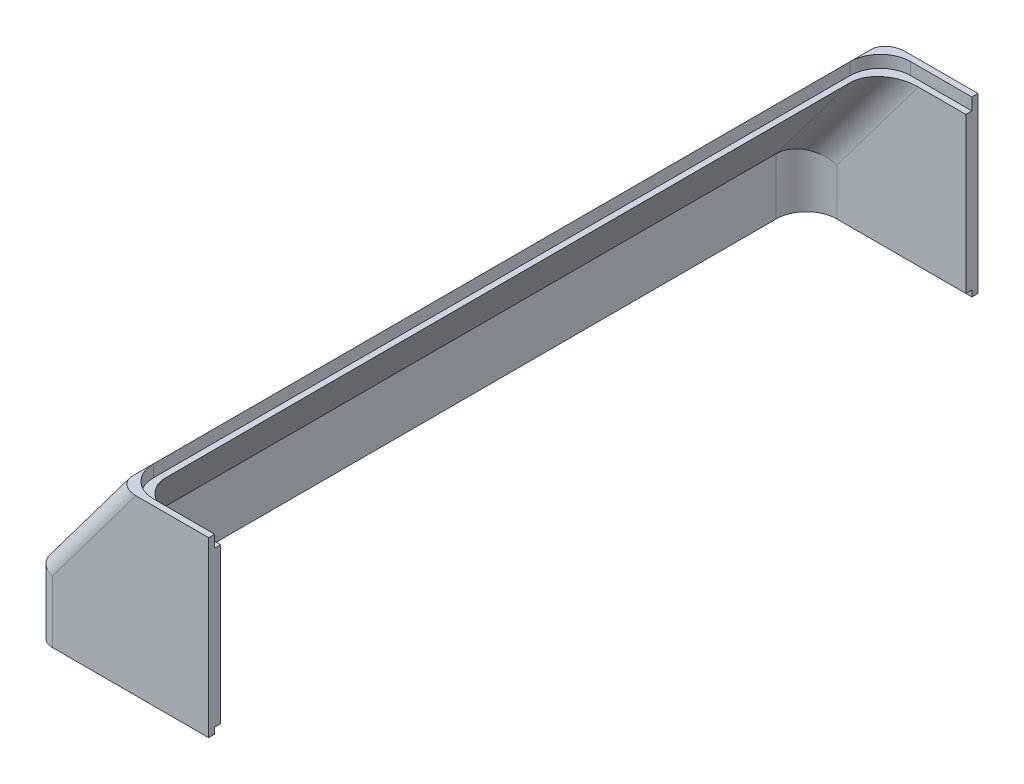
ISO-10303-21;
HEADER;
FILE_DESCRIPTION(('STEP AP214'),'2;1');
FILE_NAME('part.step','',(''),(''),'','','');
FILE_SCHEMA(('AUTOMOTIVE_DESIGN { 1 0 10303 214 1 1 1 1 }'));
ENDSEC;
DATA;
#1=APPLICATION_CONTEXT('core data for automotive mechanical design processes');
#2=APPLICATION_PROTOCOL_DEFINITION('international standard','automotive_design',2000,#1);
#3=PRODUCT_CONTEXT('',#1,'mechanical');
#4=PRODUCT('Part','Part','',(#3));
#5=PRODUCT_RELATED_PRODUCT_CATEGORY('part','',(#4));
#6=PRODUCT_DEFINITION_FORMATION('','',#4);
#7=PRODUCT_DEFINITION_CONTEXT('part definition',#1,'design');
#8=PRODUCT_DEFINITION('design','',#6,#7);
#9=PRODUCT_DEFINITION_SHAPE('','',#8);
#10=(LENGTH_UNIT() NAMED_UNIT(*) SI_UNIT(.MILLI.,.METRE.));
#11=(NAMED_UNIT(*) PLANE_ANGLE_UNIT() SI_UNIT($,.RADIAN.));
#12=(NAMED_UNIT(*) SI_UNIT($,.STERADIAN.) SOLID_ANGLE_UNIT());
#13=UNCERTAINTY_MEASURE_WITH_UNIT(LENGTH_MEASURE(1.E-05),#10,'distance_accuracy_value','');
#14=(GEOMETRIC_REPRESENTATION_CONTEXT(3) GLOBAL_UNCERTAINTY_ASSIGNED_CONTEXT((#13)) GLOBAL_UNIT_ASSIGNED_CONTEXT((#10,
#11,#12)) REPRESENTATION_CONTEXT('',''));
#15=CARTESIAN_POINT('',(0.,0.,0.));
#16=DIRECTION('',(0.,0.,1.));
#17=DIRECTION('',(1.,0.,0.));
#18=AXIS2_PLACEMENT_3D('',#15,#16,#17);
#19=CARTESIAN_POINT('',(-28.0554244693189,-2.,123.));
#20=DIRECTION('',(0.,1.,0.));
#21=DIRECTION('',(0.,0.,1.));
#22=AXIS2_PLACEMENT_3D('',#19,#20,#21);
#23=PLANE('',#22);
#24=DIRECTION('',(0.,0.,-1.));
#25=VECTOR('',#24,1.);
#26=CARTESIAN_POINT('',(-30.0554244693189,-2.,123.));
#27=LINE('',#26,#25);
#28=CARTESIAN_POINT('',(-30.0554244693189,-2.,122.));
#29=VERTEX_POINT('',#28);
#30=CARTESIAN_POINT('',(-30.0554244693189,-2.,-122.));
#31=VERTEX_POINT('',#30);
#32=EDGE_CURVE('E380',#29,#31,#27,.T.);
#33=ORIENTED_EDGE('',*,*,#32,.T.);
#34=CARTESIAN_POINT('',(-25.0554244693189,-2.,-122.));
#35=DIRECTION('',(0.,1.,0.));
#36=DIRECTION('',(0.,0.,1.));
#37=AXIS2_PLACEMENT_3D('',#34,#35,#36);
#38=CIRCLE('',#37,5.);
#39=CARTESIAN_POINT('',(-25.0554244693189,-2.,-127.));
#40=VERTEX_POINT('',#39);
#41=EDGE_CURVE('E534',#31,#40,#38,.F.);
#42=ORIENTED_EDGE('',*,*,#41,.T.);
#43=DIRECTION('',(-1.,0.,0.));
#44=VECTOR('',#43,1.);
#45=CARTESIAN_POINT('',(0.,-2.,-127.));
#46=LINE('',#45,#44);
#47=CARTESIAN_POINT('',(26.5576467995486,-2.,-127.));
#48=VERTEX_POINT('',#47);
#49=EDGE_CURVE('E287',#48,#40,#46,.T.);
#50=ORIENTED_EDGE('',*,*,#49,.F.);
#51=DIRECTION('',(0.,0.,1.));
#52=VECTOR('',#51,1.);
#53=CARTESIAN_POINT('',(26.5576467995486,-2.,-127.));
#54=LINE('',#53,#52);
#55=CARTESIAN_POINT('',(26.5576467995486,-2.,-125.));
#56=VERTEX_POINT('',#55);
#57=EDGE_CURVE('E303',#48,#56,#54,.T.);
#58=ORIENTED_EDGE('',*,*,#57,.T.);
#59=DIRECTION('',(1.,0.,0.));
#60=VECTOR('',#59,1.);
#61=CARTESIAN_POINT('',(-30.8838515940651,-2.,-125.));
#62=LINE('',#61,#60);
#63=CARTESIAN_POINT('',(-18.0554244693189,-2.,-125.));
#64=VERTEX_POINT('',#63);
#65=EDGE_CURVE('E251',#64,#56,#62,.T.);
#66=ORIENTED_EDGE('',*,*,#65,.F.);
#67=CARTESIAN_POINT('',(-18.0554244693189,-2.,-115.));
#68=DIRECTION('',(0.,1.,0.));
#69=DIRECTION('',(0.,0.,1.));
#70=AXIS2_PLACEMENT_3D('',#67,#68,#69);
#71=CIRCLE('',#70,10.);
#72=CARTESIAN_POINT('',(-28.0554244693189,-2.,-115.));
#73=VERTEX_POINT('',#72);
#74=EDGE_CURVE('E507',#64,#73,#71,.T.);
#75=ORIENTED_EDGE('',*,*,#74,.T.);
#76=DIRECTION('',(0.,0.,-1.));
#77=VECTOR('',#76,1.);
#78=CARTESIAN_POINT('',(-28.0554244693189,-2.,123.));
#79=LINE('',#78,#77);
#80=CARTESIAN_POINT('',(-28.0554244693189,-2.,115.));
#81=VERTEX_POINT('',#80);
#82=EDGE_CURVE('E376',#81,#73,#79,.T.);
#83=ORIENTED_EDGE('',*,*,#82,.F.);
#84=CARTESIAN_POINT('',(-18.0554244693189,-2.,115.));
#85=DIRECTION('',(0.,1.,0.));
#86=DIRECTION('',(0.,0.,1.));
#87=AXIS2_PLACEMENT_3D('',#84,#85,#86);
#88=CIRCLE('',#87,10.);
#89=CARTESIAN_POINT('',(-18.0554244693189,-2.,125.));
#90=VERTEX_POINT('',#89);
#91=EDGE_CURVE('E430',#81,#90,#88,.T.);
#92=ORIENTED_EDGE('',*,*,#91,.T.);
#93=DIRECTION('',(1.,0.,0.));
#94=VECTOR('',#93,1.);
#95=CARTESIAN_POINT('',(-30.8838515940651,-2.,125.));
#96=LINE('',#95,#94);
#97=CARTESIAN_POINT('',(26.5576467995486,-2.,125.));
#98=VERTEX_POINT('',#97);
#99=EDGE_CURVE('E311',#90,#98,#96,.T.);
#100=ORIENTED_EDGE('',*,*,#99,.T.);
#101=DIRECTION('',(0.,0.,-1.));
#102=VECTOR('',#101,1.);
#103=CARTESIAN_POINT('',(26.5576467995486,-2.,127.));
#104=LINE('',#103,#102);
#105=CARTESIAN_POINT('',(26.5576467995486,-2.,127.));
#106=VERTEX_POINT('',#105);
#107=EDGE_CURVE('E355',#106,#98,#104,.T.);
#108=ORIENTED_EDGE('',*,*,#107,.F.);
#109=DIRECTION('',(-1.,0.,0.));
#110=VECTOR('',#109,1.);
#111=CARTESIAN_POINT('',(0.,-2.,127.));
#112=LINE('',#111,#110);
#113=CARTESIAN_POINT('',(-25.0554244693189,-2.,127.));
#114=VERTEX_POINT('',#113);
#115=EDGE_CURVE('E351',#106,#114,#112,.T.);
#116=ORIENTED_EDGE('',*,*,#115,.T.);
#117=CARTESIAN_POINT('',(-25.0554244693189,-2.,122.));
#118=DIRECTION('',(0.,1.,0.));
#119=DIRECTION('',(0.,0.,1.));
#120=AXIS2_PLACEMENT_3D('',#117,#118,#119);
#121=CIRCLE('',#120,5.);
#122=EDGE_CURVE('E462',#114,#29,#121,.F.);
#123=ORIENTED_EDGE('',*,*,#122,.T.);
#124=EDGE_LOOP('',(#33,#42,#50,#58,#66,#75,#83,#92,#100,#108,#116,#123));
#125=FACE_BOUND('',#124,.T.);
#126=ADVANCED_FACE('F47',(#125),#23,.F.);
#127=CARTESIAN_POINT('',(26.5576467995486,0.,-127.));
#128=DIRECTION('',(1.,0.,0.));
#129=DIRECTION('',(0.,0.,-1.));
#130=AXIS2_PLACEMENT_3D('',#127,#128,#129);
#131=PLANE('',#130);
#132=DIRECTION('',(0.,1.,0.));
#133=VECTOR('',#132,1.);
#134=CARTESIAN_POINT('',(26.5576467995486,0.,-123.));
#135=LINE('',#134,#133);
#136=CARTESIAN_POINT('',(26.5576467995486,0.,-123.));
#137=VERTEX_POINT('',#136);
#138=CARTESIAN_POINT('',(26.5576467995486,51.1883170126368,-123.));
#139=VERTEX_POINT('',#138);
#140=EDGE_CURVE('E259',#137,#139,#135,.T.);
#141=ORIENTED_EDGE('',*,*,#140,.F.);
#142=DIRECTION('',(0.,0.,-1.));
#143=VECTOR('',#142,1.);
#144=CARTESIAN_POINT('',(26.5576467995486,0.,0.));
#145=LINE('',#144,#143);
#146=CARTESIAN_POINT('',(26.5576467995486,0.,-125.));
#147=VERTEX_POINT('',#146);
#148=EDGE_CURVE('E238',#137,#147,#145,.T.);
#149=ORIENTED_EDGE('',*,*,#148,.T.);
#150=DIRECTION('',(0.,-1.,0.));
#151=VECTOR('',#150,1.);
#152=CARTESIAN_POINT('',(26.5576467995486,0.,-125.));
#153=LINE('',#152,#151);
#154=EDGE_CURVE('E246',#147,#56,#153,.T.);
#155=ORIENTED_EDGE('',*,*,#154,.T.);
#156=ORIENTED_EDGE('',*,*,#57,.F.);
#157=DIRECTION('',(0.,1.,0.));
#158=VECTOR('',#157,1.);
#159=CARTESIAN_POINT('',(26.5576467995486,0.,-127.));
#160=LINE('',#159,#158);
#161=CARTESIAN_POINT('',(26.5576467995486,55.1883170126368,-127.));
#162=VERTEX_POINT('',#161);
#163=EDGE_CURVE('E283',#48,#162,#160,.T.);
#164=ORIENTED_EDGE('',*,*,#163,.T.);
#165=DIRECTION('',(0.,0.,1.));
#166=VECTOR('',#165,1.);
#167=CARTESIAN_POINT('',(26.5576467995486,55.1883170126368,-127.));
#168=LINE('',#167,#166);
#169=CARTESIAN_POINT('',(26.5576467995486,55.1883170126368,-125.));
#170=VERTEX_POINT('',#169);
#171=EDGE_CURVE('E294',#162,#170,#168,.T.);
#172=ORIENTED_EDGE('',*,*,#171,.T.);
#173=DIRECTION('',(0.,-1.,0.));
#174=VECTOR('',#173,1.);
#175=CARTESIAN_POINT('',(26.5576467995486,55.1883170126368,-125.));
#176=LINE('',#175,#174);
#177=CARTESIAN_POINT('',(26.5576467995486,51.1883170126368,-125.));
#178=VERTEX_POINT('',#177);
#179=EDGE_CURVE('E270',#170,#178,#176,.T.);
#180=ORIENTED_EDGE('',*,*,#179,.T.);
#181=DIRECTION('',(0.,0.,-1.));
#182=VECTOR('',#181,1.);
#183=CARTESIAN_POINT('',(26.5576467995486,51.1883170126368,-123.));
#184=LINE('',#183,#182);
#185=EDGE_CURVE('E269',#139,#178,#184,.T.);
#186=ORIENTED_EDGE('',*,*,#185,.F.);
#187=EDGE_LOOP('',(#141,#149,#155,#156,#164,#172,#180,#186));
#188=FACE_BOUND('',#187,.T.);
#189=ADVANCED_FACE('F257',(#188),#131,.T.);
#190=CARTESIAN_POINT('',(0.,0.,-123.));
#191=DIRECTION('',(0.,0.,-1.));
#192=DIRECTION('',(1.,0.,0.));
#193=AXIS2_PLACEMENT_3D('',#190,#191,#192);
#194=PLANE('',#193);
#195=DIRECTION('',(-1.,0.,0.));
#196=VECTOR('',#195,1.);
#197=CARTESIAN_POINT('',(0.,51.1883170126368,-123.));
#198=LINE('',#197,#196);
#199=CARTESIAN_POINT('',(10.8358132901587,51.1883170126368,-123.));
#200=VERTEX_POINT('',#199);
#201=EDGE_CURVE('E471',#139,#200,#198,.T.);
#202=ORIENTED_EDGE('',*,*,#201,.T.);
#203=DIRECTION('',(0.6,0.8,0.));
#204=VECTOR('',#203,1.);
#205=CARTESIAN_POINT('',(-18.0554244693189,12.6666666666667,-123.));
#206=LINE('',#205,#204);
#207=CARTESIAN_POINT('',(-16.0554244693189,15.3333333333333,-123.));
#208=VERTEX_POINT('',#207);
#209=EDGE_CURVE('E501',#200,#208,#206,.F.);
#210=ORIENTED_EDGE('',*,*,#209,.T.);
#211=DIRECTION('',(0.,1.,0.));
#212=VECTOR('',#211,1.);
#213=CARTESIAN_POINT('',(-16.0554244693189,0.,-123.));
#214=LINE('',#213,#212);
#215=CARTESIAN_POINT('',(-16.0554244693189,0.,-123.));
#216=VERTEX_POINT('',#215);
#217=EDGE_CURVE('E498',#208,#216,#214,.F.);
#218=ORIENTED_EDGE('',*,*,#217,.T.);
#219=DIRECTION('',(-1.,0.,0.));
#220=VECTOR('',#219,1.);
#221=CARTESIAN_POINT('',(0.,0.,-123.));
#222=LINE('',#221,#220);
#223=EDGE_CURVE('E477',#137,#216,#222,.T.);
#224=ORIENTED_EDGE('',*,*,#223,.F.);
#225=ORIENTED_EDGE('',*,*,#140,.T.);
#226=EDGE_LOOP('',(#202,#210,#218,#224,#225));
#227=FACE_BOUND('',#226,.T.);
#228=ADVANCED_FACE('F584',(#227),#194,.F.);
#229=CARTESIAN_POINT('',(0.,55.1883170126368,-127.));
#230=DIRECTION('',(0.,1.,0.));
#231=DIRECTION('',(0.,0.,1.));
#232=AXIS2_PLACEMENT_3D('',#229,#230,#231);
#233=PLANE('',#232);
#234=DIRECTION('',(-1.,0.,0.));
#235=VECTOR('',#234,1.);
#236=CARTESIAN_POINT('',(0.,55.1883170126368,-127.));
#237=LINE('',#236,#235);
#238=CARTESIAN_POINT('',(2.58581329015868,55.1883170126368,-127.));
#239=VERTEX_POINT('',#238);
#240=EDGE_CURVE('E291',#162,#239,#237,.T.);
#241=ORIENTED_EDGE('',*,*,#240,.T.);
#242=CARTESIAN_POINT('',(2.58581329015868,55.1883170126368,-122.));
#243=DIRECTION('',(0.,1.,0.));
#244=DIRECTION('',(-1.,0.,0.));
#245=AXIS2_PLACEMENT_3D('',#242,#243,#244);
#246=ELLIPSE('',#245,6.25,5.);
#247=CARTESIAN_POINT('',(-3.66418670984131,55.1883170126368,-122.));
#248=VERTEX_POINT('',#247);
#249=EDGE_CURVE('E57',#239,#248,#246,.T.);
#250=ORIENTED_EDGE('',*,*,#249,.T.);
#251=DIRECTION('',(0.,0.,1.));
#252=VECTOR('',#251,1.);
#253=CARTESIAN_POINT('',(-3.66418670984131,55.1883170126368,-127.));
#254=LINE('',#253,#252);
#255=CARTESIAN_POINT('',(-3.66418670984131,55.1883170126368,-115.));
#256=VERTEX_POINT('',#255);
#257=EDGE_CURVE('E300',#248,#256,#254,.T.);
#258=ORIENTED_EDGE('',*,*,#257,.T.);
#259=CARTESIAN_POINT('',(6.33581329015868,55.1883170126368,-115.));
#260=DIRECTION('',(0.,1.,0.));
#261=DIRECTION('',(0.,0.,1.));
#262=AXIS2_PLACEMENT_3D('',#259,#260,#261);
#263=CIRCLE('',#262,10.);
#264=CARTESIAN_POINT('',(6.33581329015868,55.1883170126368,-125.));
#265=VERTEX_POINT('',#264);
#266=EDGE_CURVE('E510',#256,#265,#263,.F.);
#267=ORIENTED_EDGE('',*,*,#266,.T.);
#268=DIRECTION('',(1.,0.,0.));
#269=VECTOR('',#268,1.);
#270=CARTESIAN_POINT('',(-8.13632266484089,55.1883170126368,-125.));
#271=LINE('',#270,#269);
#272=EDGE_CURVE('E274',#265,#170,#271,.T.);
#273=ORIENTED_EDGE('',*,*,#272,.T.);
#274=ORIENTED_EDGE('',*,*,#171,.F.);
#275=EDGE_LOOP('',(#241,#250,#258,#267,#273,#274));
#276=FACE_BOUND('',#275,.T.);
#277=ADVANCED_FACE('F554',(#276),#233,.T.);
#278=CARTESIAN_POINT('',(0.,0.,123.));
#279=DIRECTION('',(0.,0.,1.));
#280=DIRECTION('',(1.,0.,0.));
#281=AXIS2_PLACEMENT_3D('',#278,#279,#280);
#282=PLANE('',#281);
#283=DIRECTION('',(0.,1.,0.));
#284=VECTOR('',#283,1.);
#285=CARTESIAN_POINT('',(-16.0554244693189,18.6666666666667,123.));
#286=LINE('',#285,#284);
#287=CARTESIAN_POINT('',(-16.0554244693189,0.,123.));
#288=VERTEX_POINT('',#287);
#289=CARTESIAN_POINT('',(-16.0554244693189,15.3333333333333,123.));
#290=VERTEX_POINT('',#289);
#291=EDGE_CURVE('E417',#288,#290,#286,.T.);
#292=ORIENTED_EDGE('',*,*,#291,.T.);
#293=DIRECTION('',(0.6,0.8,0.));
#294=VECTOR('',#293,1.);
#295=CARTESIAN_POINT('',(6.33581329015869,45.1883170126368,123.));
#296=LINE('',#295,#294);
#297=CARTESIAN_POINT('',(10.8358132901587,51.1883170126368,123.));
#298=VERTEX_POINT('',#297);
#299=EDGE_CURVE('E420',#290,#298,#296,.T.);
#300=ORIENTED_EDGE('',*,*,#299,.T.);
#301=DIRECTION('',(1.,0.,0.));
#302=VECTOR('',#301,1.);
#303=CARTESIAN_POINT('',(-8.13632266484089,51.1883170126368,123.));
#304=LINE('',#303,#302);
#305=CARTESIAN_POINT('',(26.5576467995486,51.1883170126368,123.));
#306=VERTEX_POINT('',#305);
#307=EDGE_CURVE('E331',#298,#306,#304,.T.);
#308=ORIENTED_EDGE('',*,*,#307,.T.);
#309=DIRECTION('',(0.,1.,0.));
#310=VECTOR('',#309,1.);
#311=CARTESIAN_POINT('',(26.5576467995486,0.,123.));
#312=LINE('',#311,#310);
#313=CARTESIAN_POINT('',(26.5576467995486,0.,123.));
#314=VERTEX_POINT('',#313);
#315=EDGE_CURVE('E342',#314,#306,#312,.T.);
#316=ORIENTED_EDGE('',*,*,#315,.F.);
#317=DIRECTION('',(1.,0.,0.));
#318=VECTOR('',#317,1.);
#319=CARTESIAN_POINT('',(-30.8838515940651,0.,123.));
#320=LINE('',#319,#318);
#321=EDGE_CURVE('E317',#288,#314,#320,.T.);
#322=ORIENTED_EDGE('',*,*,#321,.F.);
#323=EDGE_LOOP('',(#292,#300,#308,#316,#322));
#324=FACE_BOUND('',#323,.T.);
#325=ADVANCED_FACE('F611',(#324),#282,.F.);
#326=CARTESIAN_POINT('',(-26.0554244693189,18.6666666666667,123.));
#327=DIRECTION('',(-1.,0.,0.));
#328=DIRECTION('',(0.,-1.,0.));
#329=AXIS2_PLACEMENT_3D('',#326,#327,#328);
#330=PLANE('',#329);
#331=DIRECTION('',(0.,0.,-1.));
#332=VECTOR('',#331,1.);
#333=CARTESIAN_POINT('',(-26.0554244693189,0.,123.));
#334=LINE('',#333,#332);
#335=CARTESIAN_POINT('',(-26.0554244693189,0.,113.));
#336=VERTEX_POINT('',#335);
#337=CARTESIAN_POINT('',(-26.0554244693189,0.,-113.));
#338=VERTEX_POINT('',#337);
#339=EDGE_CURVE('E369',#336,#338,#334,.T.);
#340=ORIENTED_EDGE('',*,*,#339,.T.);
#341=DIRECTION('',(0.,1.,0.));
#342=VECTOR('',#341,1.);
#343=CARTESIAN_POINT('',(-26.0554244693189,18.6666666666667,-113.));
#344=LINE('',#343,#342);
#345=CARTESIAN_POINT('',(-26.0554244693189,18.6666666666667,-113.));
#346=VERTEX_POINT('',#345);
#347=EDGE_CURVE('E504',#338,#346,#344,.T.);
#348=ORIENTED_EDGE('',*,*,#347,.T.);
#349=DIRECTION('',(0.,0.,-1.));
#350=VECTOR('',#349,1.);
#351=CARTESIAN_POINT('',(-26.0554244693189,18.6666666666667,123.));
#352=LINE('',#351,#350);
#353=CARTESIAN_POINT('',(-26.0554244693189,18.6666666666667,113.));
#354=VERTEX_POINT('',#353);
#355=EDGE_CURVE('E399',#354,#346,#352,.T.);
#356=ORIENTED_EDGE('',*,*,#355,.F.);
#357=DIRECTION('',(0.,1.,0.));
#358=VECTOR('',#357,1.);
#359=CARTESIAN_POINT('',(-26.0554244693189,0.,113.));
#360=LINE('',#359,#358);
#361=EDGE_CURVE('E427',#354,#336,#360,.F.);
#362=ORIENTED_EDGE('',*,*,#361,.T.);
#363=EDGE_LOOP('',(#340,#348,#356,#362));
#364=FACE_BOUND('',#363,.T.);
#365=ADVANCED_FACE('F607',(#364),#330,.F.);
#366=CARTESIAN_POINT('',(-1.66418670984132,51.1883170126368,123.));
#367=DIRECTION('',(-0.8,0.6,0.));
#368=DIRECTION('',(-0.6,-0.8,0.));
#369=AXIS2_PLACEMENT_3D('',#366,#367,#368);
#370=PLANE('',#369);
#371=ORIENTED_EDGE('',*,*,#355,.T.);
#372=DIRECTION('',(0.6,0.8,0.));
#373=VECTOR('',#372,1.);
#374=CARTESIAN_POINT('',(-1.66418670984132,51.1883170126368,-113.));
#375=LINE('',#374,#373);
#376=CARTESIAN_POINT('',(-1.66418670984132,51.1883170126368,-113.));
#377=VERTEX_POINT('',#376);
#378=EDGE_CURVE('E494',#346,#377,#375,.T.);
#379=ORIENTED_EDGE('',*,*,#378,.T.);
#380=DIRECTION('',(0.,0.,-1.));
#381=VECTOR('',#380,1.);
#382=CARTESIAN_POINT('',(-1.66418670984132,51.1883170126368,123.));
#383=LINE('',#382,#381);
#384=CARTESIAN_POINT('',(-1.66418670984132,51.1883170126368,113.));
#385=VERTEX_POINT('',#384);
#386=EDGE_CURVE('E395',#385,#377,#383,.T.);
#387=ORIENTED_EDGE('',*,*,#386,.F.);
#388=DIRECTION('',(0.6,0.8,0.));
#389=VECTOR('',#388,1.);
#390=CARTESIAN_POINT('',(-26.0554244693189,18.6666666666667,113.));
#391=LINE('',#390,#389);
#392=EDGE_CURVE('E424',#385,#354,#391,.F.);
#393=ORIENTED_EDGE('',*,*,#392,.T.);
#394=EDGE_LOOP('',(#371,#379,#387,#393));
#395=FACE_BOUND('',#394,.T.);
#396=ADVANCED_FACE('F603',(#395),#370,.F.);
#397=CARTESIAN_POINT('',(-3.66418670984132,51.1883170126368,123.));
#398=DIRECTION('',(0.,-1.,0.));
#399=DIRECTION('',(0.,0.,-1.));
#400=AXIS2_PLACEMENT_3D('',#397,#398,#399);
#401=PLANE('',#400);
#402=DIRECTION('',(1.,0.,0.));
#403=VECTOR('',#402,1.);
#404=CARTESIAN_POINT('',(-8.13632266484089,51.1883170126368,-125.));
#405=LINE('',#404,#403);
#406=CARTESIAN_POINT('',(6.33581329015868,51.1883170126368,-125.));
#407=VERTEX_POINT('',#406);
#408=EDGE_CURVE('E278',#407,#178,#405,.T.);
#409=ORIENTED_EDGE('',*,*,#408,.F.);
#410=CARTESIAN_POINT('',(6.33581329015868,51.1883170126368,-115.));
#411=DIRECTION('',(0.,-1.,0.));
#412=DIRECTION('',(0.,0.,-1.));
#413=AXIS2_PLACEMENT_3D('',#410,#411,#412);
#414=CIRCLE('',#413,10.);
#415=CARTESIAN_POINT('',(-3.66418670984132,51.1883170126368,-115.));
#416=VERTEX_POINT('',#415);
#417=EDGE_CURVE('E521',#407,#416,#414,.F.);
#418=ORIENTED_EDGE('',*,*,#417,.T.);
#419=DIRECTION('',(0.,0.,-1.));
#420=VECTOR('',#419,1.);
#421=CARTESIAN_POINT('',(-3.66418670984132,51.1883170126368,123.));
#422=LINE('',#421,#420);
#423=CARTESIAN_POINT('',(-3.66418670984132,51.1883170126368,115.));
#424=VERTEX_POINT('',#423);
#425=EDGE_CURVE('E391',#424,#416,#422,.T.);
#426=ORIENTED_EDGE('',*,*,#425,.F.);
#427=CARTESIAN_POINT('',(6.33581329015868,51.1883170126368,115.));
#428=DIRECTION('',(0.,-1.,0.));
#429=DIRECTION('',(0.,0.,-1.));
#430=AXIS2_PLACEMENT_3D('',#427,#428,#429);
#431=CIRCLE('',#430,10.);
#432=CARTESIAN_POINT('',(6.33581329015868,51.1883170126368,125.));
#433=VERTEX_POINT('',#432);
#434=EDGE_CURVE('E446',#424,#433,#431,.F.);
#435=ORIENTED_EDGE('',*,*,#434,.T.);
#436=DIRECTION('',(1.,0.,0.));
#437=VECTOR('',#436,1.);
#438=CARTESIAN_POINT('',(-8.13632266484089,51.1883170126368,125.));
#439=LINE('',#438,#437);
#440=CARTESIAN_POINT('',(26.5576467995486,51.1883170126368,125.));
#441=VERTEX_POINT('',#440);
#442=EDGE_CURVE('E335',#433,#441,#439,.T.);
#443=ORIENTED_EDGE('',*,*,#442,.T.);
#444=DIRECTION('',(0.,0.,1.));
#445=VECTOR('',#444,1.);
#446=CARTESIAN_POINT('',(26.5576467995486,51.1883170126368,123.));
#447=LINE('',#446,#445);
#448=EDGE_CURVE('E326',#306,#441,#447,.T.);
#449=ORIENTED_EDGE('',*,*,#448,.F.);
#450=ORIENTED_EDGE('',*,*,#307,.F.);
#451=CARTESIAN_POINT('',(10.8358132901587,51.1883170126368,113.));
#452=DIRECTION('',(0.,-1.,0.));
#453=DIRECTION('',(-1.,0.,0.));
#454=AXIS2_PLACEMENT_3D('',#451,#452,#453);
#455=ELLIPSE('',#454,12.5,10.);
#456=EDGE_CURVE('E437',#298,#385,#455,.T.);
#457=ORIENTED_EDGE('',*,*,#456,.T.);
#458=ORIENTED_EDGE('',*,*,#386,.T.);
#459=CARTESIAN_POINT('',(10.8358132901587,51.1883170126368,-113.));
#460=DIRECTION('',(0.,-1.,0.));
#461=DIRECTION('',(-1.,0.,0.));
#462=AXIS2_PLACEMENT_3D('',#459,#460,#461);
#463=ELLIPSE('',#462,12.5,10.);
#464=EDGE_CURVE('E513',#377,#200,#463,.T.);
#465=ORIENTED_EDGE('',*,*,#464,.T.);
#466=ORIENTED_EDGE('',*,*,#201,.F.);
#467=ORIENTED_EDGE('',*,*,#185,.T.);
#468=EDGE_LOOP('',(#409,#418,#426,#435,#443,#449,#450,#457,#458,#465,#466,#467));
#469=FACE_BOUND('',#468,.T.);
#470=ADVANCED_FACE('F599',(#469),#401,.F.);
#471=CARTESIAN_POINT('',(-3.66418670984132,55.1883170126368,123.));
#472=DIRECTION('',(-1.,0.,0.));
#473=DIRECTION('',(0.,-1.,0.));
#474=AXIS2_PLACEMENT_3D('',#471,#472,#473);
#475=PLANE('',#474);
#476=ORIENTED_EDGE('',*,*,#425,.T.);
#477=DIRECTION('',(0.,-1.,0.));
#478=VECTOR('',#477,1.);
#479=CARTESIAN_POINT('',(-3.66418670984132,55.1883170126368,-115.));
#480=LINE('',#479,#478);
#481=EDGE_CURVE('E490',#416,#256,#480,.F.);
#482=ORIENTED_EDGE('',*,*,#481,.T.);
#483=DIRECTION('',(0.,0.,-1.));
#484=VECTOR('',#483,1.);
#485=CARTESIAN_POINT('',(-3.66418670984132,55.1883170126368,123.));
#486=LINE('',#485,#484);
#487=CARTESIAN_POINT('',(-3.66418670984132,55.1883170126368,115.));
#488=VERTEX_POINT('',#487);
#489=EDGE_CURVE('E387',#488,#256,#486,.T.);
#490=ORIENTED_EDGE('',*,*,#489,.F.);
#491=DIRECTION('',(0.,-1.,0.));
#492=VECTOR('',#491,1.);
#493=CARTESIAN_POINT('',(-3.66418670984132,51.1883170126368,115.));
#494=LINE('',#493,#492);
#495=EDGE_CURVE('E410',#488,#424,#494,.T.);
#496=ORIENTED_EDGE('',*,*,#495,.T.);
#497=EDGE_LOOP('',(#476,#482,#490,#496));
#498=FACE_BOUND('',#497,.T.);
#499=ADVANCED_FACE('F596',(#498),#475,.F.);
#500=CARTESIAN_POINT('',(-3.66418670984132,55.1883170126368,123.));
#501=DIRECTION('',(0.8,-0.6,0.));
#502=DIRECTION('',(0.6,0.8,0.));
#503=AXIS2_PLACEMENT_3D('',#500,#501,#502);
#504=PLANE('',#503);
#505=ORIENTED_EDGE('',*,*,#257,.F.);
#506=DIRECTION('',(0.6,0.8,0.));
#507=VECTOR('',#506,1.);
#508=CARTESIAN_POINT('',(-30.0554244693189,20.,-122.));
#509=LINE('',#508,#507);
#510=CARTESIAN_POINT('',(-30.0554244693189,20.,-122.));
#511=VERTEX_POINT('',#510);
#512=EDGE_CURVE('E11',#248,#511,#509,.F.);
#513=ORIENTED_EDGE('',*,*,#512,.T.);
#514=DIRECTION('',(0.,0.,-1.));
#515=VECTOR('',#514,1.);
#516=CARTESIAN_POINT('',(-30.0554244693189,20.,123.));
#517=LINE('',#516,#515);
#518=CARTESIAN_POINT('',(-30.0554244693189,20.,122.));
#519=VERTEX_POINT('',#518);
#520=EDGE_CURVE('E384',#519,#511,#517,.T.);
#521=ORIENTED_EDGE('',*,*,#520,.F.);
#522=DIRECTION('',(0.6,0.8,0.));
#523=VECTOR('',#522,1.);
#524=CARTESIAN_POINT('',(-3.66418670984132,55.1883170126368,122.));
#525=LINE('',#524,#523);
#526=CARTESIAN_POINT('',(-3.66418670984131,55.1883170126368,122.));
#527=VERTEX_POINT('',#526);
#528=EDGE_CURVE('E465',#519,#527,#525,.T.);
#529=ORIENTED_EDGE('',*,*,#528,.T.);
#530=DIRECTION('',(0.,0.,-1.));
#531=VECTOR('',#530,1.);
#532=CARTESIAN_POINT('',(-3.66418670984131,55.1883170126368,127.));
#533=LINE('',#532,#531);
#534=EDGE_CURVE('E362',#527,#488,#533,.T.);
#535=ORIENTED_EDGE('',*,*,#534,.T.);
#536=ORIENTED_EDGE('',*,*,#489,.T.);
#537=EDGE_LOOP('',(#505,#513,#521,#529,#535,#536));
#538=FACE_BOUND('',#537,.T.);
#539=ADVANCED_FACE('F592',(#538),#504,.F.);
#540=CARTESIAN_POINT('',(-30.0554244693189,-2.,123.));
#541=DIRECTION('',(1.,0.,0.));
#542=DIRECTION('',(0.,0.,-1.));
#543=AXIS2_PLACEMENT_3D('',#540,#541,#542);
#544=PLANE('',#543);
#545=ORIENTED_EDGE('',*,*,#520,.T.);
#546=DIRECTION('',(0.,1.,0.));
#547=VECTOR('',#546,1.);
#548=CARTESIAN_POINT('',(-30.0554244693189,-2.,-122.));
#549=LINE('',#548,#547);
#550=EDGE_CURVE('E531',#511,#31,#549,.F.);
#551=ORIENTED_EDGE('',*,*,#550,.T.);
#552=ORIENTED_EDGE('',*,*,#32,.F.);
#553=DIRECTION('',(0.,1.,0.));
#554=VECTOR('',#553,1.);
#555=CARTESIAN_POINT('',(-30.0554244693189,20.,122.));
#556=LINE('',#555,#554);
#557=EDGE_CURVE('E449',#29,#519,#556,.T.);
#558=ORIENTED_EDGE('',*,*,#557,.T.);
#559=EDGE_LOOP('',(#545,#551,#552,#558));
#560=FACE_BOUND('',#559,.T.);
#561=ADVANCED_FACE('F589',(#560),#544,.F.);
#562=CARTESIAN_POINT('',(-28.0554244693189,-2.,123.));
#563=DIRECTION('',(-1.,0.,0.));
#564=DIRECTION('',(0.,0.,1.));
#565=AXIS2_PLACEMENT_3D('',#562,#563,#564);
#566=PLANE('',#565);
#567=ORIENTED_EDGE('',*,*,#82,.T.);
#568=DIRECTION('',(0.,-1.,0.));
#569=VECTOR('',#568,1.);
#570=CARTESIAN_POINT('',(-28.0554244693189,-2.,-115.));
#571=LINE('',#570,#569);
#572=CARTESIAN_POINT('',(-28.0554244693189,0.,-115.));
#573=VERTEX_POINT('',#572);
#574=EDGE_CURVE('E483',#73,#573,#571,.F.);
#575=ORIENTED_EDGE('',*,*,#574,.T.);
#576=DIRECTION('',(0.,0.,-1.));
#577=VECTOR('',#576,1.);
#578=CARTESIAN_POINT('',(-28.0554244693189,0.,123.));
#579=LINE('',#578,#577);
#580=CARTESIAN_POINT('',(-28.0554244693189,0.,115.));
#581=VERTEX_POINT('',#580);
#582=EDGE_CURVE('E373',#581,#573,#579,.T.);
#583=ORIENTED_EDGE('',*,*,#582,.F.);
#584=DIRECTION('',(0.,-1.,0.));
#585=VECTOR('',#584,1.);
#586=CARTESIAN_POINT('',(-28.0554244693189,-2.,115.));
#587=LINE('',#586,#585);
#588=EDGE_CURVE('E403',#581,#81,#587,.T.);
#589=ORIENTED_EDGE('',*,*,#588,.T.);
#590=EDGE_LOOP('',(#567,#575,#583,#589));
#591=FACE_BOUND('',#590,.T.);
#592=ADVANCED_FACE('F561',(#591),#566,.F.);
#593=CARTESIAN_POINT('',(-28.0554244693189,0.,123.));
#594=DIRECTION('',(0.,1.,0.));
#595=DIRECTION('',(0.,0.,1.));
#596=AXIS2_PLACEMENT_3D('',#593,#594,#595);
#597=PLANE('',#596);
#598=ORIENTED_EDGE('',*,*,#582,.T.);
#599=CARTESIAN_POINT('',(-18.0554244693189,0.,-115.));
#600=DIRECTION('',(0.,1.,0.));
#601=DIRECTION('',(0.,0.,1.));
#602=AXIS2_PLACEMENT_3D('',#599,#600,#601);
#603=CIRCLE('',#602,10.);
#604=CARTESIAN_POINT('',(-18.0554244693189,0.,-125.));
#605=VERTEX_POINT('',#604);
#606=EDGE_CURVE('E241',#573,#605,#603,.F.);
#607=ORIENTED_EDGE('',*,*,#606,.T.);
#608=DIRECTION('',(1.,0.,0.));
#609=VECTOR('',#608,1.);
#610=CARTESIAN_POINT('',(-30.8838515940651,0.,-125.));
#611=LINE('',#610,#609);
#612=EDGE_CURVE('E232',#605,#147,#611,.T.);
#613=ORIENTED_EDGE('',*,*,#612,.T.);
#614=ORIENTED_EDGE('',*,*,#148,.F.);
#615=ORIENTED_EDGE('',*,*,#223,.T.);
#616=CARTESIAN_POINT('',(-16.0554244693189,0.,-113.));
#617=DIRECTION('',(0.,1.,0.));
#618=DIRECTION('',(0.,0.,1.));
#619=AXIS2_PLACEMENT_3D('',#616,#617,#618);
#620=CIRCLE('',#619,10.);
#621=EDGE_CURVE('E516',#216,#338,#620,.T.);
#622=ORIENTED_EDGE('',*,*,#621,.T.);
#623=ORIENTED_EDGE('',*,*,#339,.F.);
#624=CARTESIAN_POINT('',(-16.0554244693189,0.,113.));
#625=DIRECTION('',(0.,1.,0.));
#626=DIRECTION('',(0.,0.,1.));
#627=AXIS2_PLACEMENT_3D('',#624,#625,#626);
#628=CIRCLE('',#627,10.);
#629=EDGE_CURVE('E440',#336,#288,#628,.T.);
#630=ORIENTED_EDGE('',*,*,#629,.T.);
#631=ORIENTED_EDGE('',*,*,#321,.T.);
#632=DIRECTION('',(0.,0.,1.));
#633=VECTOR('',#632,1.);
#634=CARTESIAN_POINT('',(26.5576467995486,0.,0.));
#635=LINE('',#634,#633);
#636=CARTESIAN_POINT('',(26.5576467995486,0.,125.));
#637=VERTEX_POINT('',#636);
#638=EDGE_CURVE('E312',#314,#637,#635,.T.);
#639=ORIENTED_EDGE('',*,*,#638,.T.);
#640=DIRECTION('',(1.,0.,0.));
#641=VECTOR('',#640,1.);
#642=CARTESIAN_POINT('',(-30.8838515940651,0.,125.));
#643=LINE('',#642,#641);
#644=CARTESIAN_POINT('',(-18.0554244693189,0.,125.));
#645=VERTEX_POINT('',#644);
#646=EDGE_CURVE('E320',#645,#637,#643,.T.);
#647=ORIENTED_EDGE('',*,*,#646,.F.);
#648=CARTESIAN_POINT('',(-18.0554244693189,0.,115.));
#649=DIRECTION('',(0.,1.,0.));
#650=DIRECTION('',(0.,0.,1.));
#651=AXIS2_PLACEMENT_3D('',#648,#649,#650);
#652=CIRCLE('',#651,10.);
#653=EDGE_CURVE('E443',#645,#581,#652,.F.);
#654=ORIENTED_EDGE('',*,*,#653,.T.);
#655=EDGE_LOOP('',(#598,#607,#613,#614,#615,#622,#623,#630,#631,#639,#647,#654));
#656=FACE_BOUND('',#655,.T.);
#657=ADVANCED_FACE('F235',(#656),#597,.F.);
#658=CARTESIAN_POINT('',(26.5576467995486,0.,127.));
#659=DIRECTION('',(-1.,0.,0.));
#660=DIRECTION('',(0.,0.,1.));
#661=AXIS2_PLACEMENT_3D('',#658,#659,#660);
#662=PLANE('',#661);
#663=ORIENTED_EDGE('',*,*,#107,.T.);
#664=DIRECTION('',(0.,-1.,0.));
#665=VECTOR('',#664,1.);
#666=CARTESIAN_POINT('',(26.5576467995486,0.,125.));
#667=LINE('',#666,#665);
#668=EDGE_CURVE('E307',#637,#98,#667,.T.);
#669=ORIENTED_EDGE('',*,*,#668,.F.);
#670=ORIENTED_EDGE('',*,*,#638,.F.);
#671=ORIENTED_EDGE('',*,*,#315,.T.);
#672=ORIENTED_EDGE('',*,*,#448,.T.);
#673=DIRECTION('',(0.,-1.,0.));
#674=VECTOR('',#673,1.);
#675=CARTESIAN_POINT('',(26.5576467995486,55.1883170126368,125.));
#676=LINE('',#675,#674);
#677=CARTESIAN_POINT('',(26.5576467995486,55.1883170126368,125.));
#678=VERTEX_POINT('',#677);
#679=EDGE_CURVE('E325',#678,#441,#676,.T.);
#680=ORIENTED_EDGE('',*,*,#679,.F.);
#681=DIRECTION('',(0.,0.,-1.));
#682=VECTOR('',#681,1.);
#683=CARTESIAN_POINT('',(26.5576467995486,55.1883170126368,127.));
#684=LINE('',#683,#682);
#685=CARTESIAN_POINT('',(26.5576467995486,55.1883170126368,127.));
#686=VERTEX_POINT('',#685);
#687=EDGE_CURVE('E365',#686,#678,#684,.T.);
#688=ORIENTED_EDGE('',*,*,#687,.F.);
#689=DIRECTION('',(0.,1.,0.));
#690=VECTOR('',#689,1.);
#691=CARTESIAN_POINT('',(26.5576467995486,0.,127.));
#692=LINE('',#691,#690);
#693=EDGE_CURVE('E343',#106,#686,#692,.T.);
#694=ORIENTED_EDGE('',*,*,#693,.F.);
#695=EDGE_LOOP('',(#663,#669,#670,#671,#672,#680,#688,#694));
#696=FACE_BOUND('',#695,.T.);
#697=ADVANCED_FACE('F653',(#696),#662,.F.);
#698=CARTESIAN_POINT('',(0.,55.1883170126368,127.));
#699=DIRECTION('',(0.,-1.,0.));
#700=DIRECTION('',(0.,0.,-1.));
#701=AXIS2_PLACEMENT_3D('',#698,#699,#700);
#702=PLANE('',#701);
#703=ORIENTED_EDGE('',*,*,#534,.F.);
#704=CARTESIAN_POINT('',(2.58581329015868,55.1883170126368,122.));
#705=DIRECTION('',(0.,-1.,0.));
#706=DIRECTION('',(-1.,0.,0.));
#707=AXIS2_PLACEMENT_3D('',#704,#705,#706);
#708=ELLIPSE('',#707,6.25,5.);
#709=CARTESIAN_POINT('',(2.58581329015868,55.1883170126368,127.));
#710=VERTEX_POINT('',#709);
#711=EDGE_CURVE('E468',#527,#710,#708,.F.);
#712=ORIENTED_EDGE('',*,*,#711,.T.);
#713=DIRECTION('',(-1.,0.,0.));
#714=VECTOR('',#713,1.);
#715=CARTESIAN_POINT('',(0.,55.1883170126368,127.));
#716=LINE('',#715,#714);
#717=EDGE_CURVE('E347',#686,#710,#716,.T.);
#718=ORIENTED_EDGE('',*,*,#717,.F.);
#719=ORIENTED_EDGE('',*,*,#687,.T.);
#720=DIRECTION('',(1.,0.,0.));
#721=VECTOR('',#720,1.);
#722=CARTESIAN_POINT('',(-8.13632266484089,55.1883170126368,125.));
#723=LINE('',#722,#721);
#724=CARTESIAN_POINT('',(6.33581329015868,55.1883170126368,125.));
#725=VERTEX_POINT('',#724);
#726=EDGE_CURVE('E330',#725,#678,#723,.T.);
#727=ORIENTED_EDGE('',*,*,#726,.F.);
#728=CARTESIAN_POINT('',(6.33581329015868,55.1883170126368,115.));
#729=DIRECTION('',(0.,-1.,0.));
#730=DIRECTION('',(0.,0.,-1.));
#731=AXIS2_PLACEMENT_3D('',#728,#729,#730);
#732=CIRCLE('',#731,10.);
#733=EDGE_CURVE('E433',#725,#488,#732,.T.);
#734=ORIENTED_EDGE('',*,*,#733,.T.);
#735=EDGE_LOOP('',(#703,#712,#718,#719,#727,#734));
#736=FACE_BOUND('',#735,.T.);
#737=ADVANCED_FACE('F644',(#736),#702,.F.);
#738=CARTESIAN_POINT('',(0.,0.,127.));
#739=DIRECTION('',(0.,0.,1.));
#740=DIRECTION('',(1.,0.,0.));
#741=AXIS2_PLACEMENT_3D('',#738,#739,#740);
#742=PLANE('',#741);
#743=DIRECTION('',(0.6,0.8,0.));
#744=VECTOR('',#743,1.);
#745=CARTESIAN_POINT('',(-26.0554244693189,17.,127.));
#746=LINE('',#745,#744);
#747=CARTESIAN_POINT('',(-25.0554244693189,18.3333333333333,127.));
#748=VERTEX_POINT('',#747);
#749=EDGE_CURVE('E456',#710,#748,#746,.F.);
#750=ORIENTED_EDGE('',*,*,#749,.T.);
#751=DIRECTION('',(0.,1.,0.));
#752=VECTOR('',#751,1.);
#753=CARTESIAN_POINT('',(-25.0554244693189,-2.,127.));
#754=LINE('',#753,#752);
#755=EDGE_CURVE('E459',#748,#114,#754,.F.);
#756=ORIENTED_EDGE('',*,*,#755,.T.);
#757=ORIENTED_EDGE('',*,*,#115,.F.);
#758=ORIENTED_EDGE('',*,*,#693,.T.);
#759=ORIENTED_EDGE('',*,*,#717,.T.);
#760=EDGE_LOOP('',(#750,#756,#757,#758,#759));
#761=FACE_BOUND('',#760,.T.);
#762=ADVANCED_FACE('F646',(#761),#742,.T.);
#763=CARTESIAN_POINT('',(-8.13632266484089,55.1883170126368,125.));
#764=DIRECTION('',(0.,0.,1.));
#765=DIRECTION('',(1.,0.,0.));
#766=AXIS2_PLACEMENT_3D('',#763,#764,#765);
#767=PLANE('',#766);
#768=ORIENTED_EDGE('',*,*,#442,.F.);
#769=DIRECTION('',(0.,-1.,0.));
#770=VECTOR('',#769,1.);
#771=CARTESIAN_POINT('',(6.33581329015868,55.1883170126368,125.));
#772=LINE('',#771,#770);
#773=EDGE_CURVE('E414',#433,#725,#772,.F.);
#774=ORIENTED_EDGE('',*,*,#773,.T.);
#775=ORIENTED_EDGE('',*,*,#726,.T.);
#776=ORIENTED_EDGE('',*,*,#679,.T.);
#777=EDGE_LOOP('',(#768,#774,#775,#776));
#778=FACE_BOUND('',#777,.T.);
#779=ADVANCED_FACE('F702',(#778),#767,.F.);
#780=CARTESIAN_POINT('',(-30.8838515940651,0.,125.));
#781=DIRECTION('',(0.,0.,1.));
#782=DIRECTION('',(1.,0.,0.));
#783=AXIS2_PLACEMENT_3D('',#780,#781,#782);
#784=PLANE('',#783);
#785=ORIENTED_EDGE('',*,*,#99,.F.);
#786=DIRECTION('',(0.,-1.,0.));
#787=VECTOR('',#786,1.);
#788=CARTESIAN_POINT('',(-18.0554244693189,0.,125.));
#789=LINE('',#788,#787);
#790=EDGE_CURVE('E407',#90,#645,#789,.F.);
#791=ORIENTED_EDGE('',*,*,#790,.T.);
#792=ORIENTED_EDGE('',*,*,#646,.T.);
#793=ORIENTED_EDGE('',*,*,#668,.T.);
#794=EDGE_LOOP('',(#785,#791,#792,#793));
#795=FACE_BOUND('',#794,.T.);
#796=ADVANCED_FACE('F617',(#795),#784,.F.);
#797=CARTESIAN_POINT('',(-18.0554244693189,-2.,115.));
#798=DIRECTION('',(0.,1.,0.));
#799=DIRECTION('',(0.,0.,1.));
#800=AXIS2_PLACEMENT_3D('',#797,#798,#799);
#801=CYLINDRICAL_SURFACE('',#800,10.);
#802=ORIENTED_EDGE('',*,*,#653,.F.);
#803=ORIENTED_EDGE('',*,*,#790,.F.);
#804=ORIENTED_EDGE('',*,*,#91,.F.);
#805=ORIENTED_EDGE('',*,*,#588,.F.);
#806=EDGE_LOOP('',(#802,#803,#804,#805));
#807=FACE_BOUND('',#806,.T.);
#808=ADVANCED_FACE('F613',(#807),#801,.F.);
#809=CARTESIAN_POINT('',(6.33581329015868,55.1883170126368,115.));
#810=DIRECTION('',(0.,1.,0.));
#811=DIRECTION('',(-1.,0.,0.));
#812=AXIS2_PLACEMENT_3D('',#809,#810,#811);
#813=CYLINDRICAL_SURFACE('',#812,10.);
#814=ORIENTED_EDGE('',*,*,#733,.F.);
#815=ORIENTED_EDGE('',*,*,#773,.F.);
#816=ORIENTED_EDGE('',*,*,#434,.F.);
#817=ORIENTED_EDGE('',*,*,#495,.F.);
#818=EDGE_LOOP('',(#814,#815,#816,#817));
#819=FACE_BOUND('',#818,.T.);
#820=ADVANCED_FACE('F616',(#819),#813,.F.);
#821=CARTESIAN_POINT('',(-16.0554244693189,0.,113.));
#822=DIRECTION('',(0.,-1.,0.));
#823=DIRECTION('',(1.,0.,0.));
#824=AXIS2_PLACEMENT_3D('',#821,#822,#823);
#825=CYLINDRICAL_SURFACE('',#824,10.);
#826=ORIENTED_EDGE('',*,*,#629,.F.);
#827=ORIENTED_EDGE('',*,*,#361,.F.);
#828=CARTESIAN_POINT('',(-16.0554244693189,15.3333333333333,113.));
#829=DIRECTION('',(-0.316227766016838,-0.948683298050514,0.));
#830=DIRECTION('',(-0.948683298050514,0.316227766016837,0.));
#831=AXIS2_PLACEMENT_3D('',#828,#829,#830);
#832=ELLIPSE('',#831,10.5409255338946,10.);
#833=EDGE_CURVE('E316',#290,#354,#832,.T.);
#834=ORIENTED_EDGE('',*,*,#833,.F.);
#835=ORIENTED_EDGE('',*,*,#291,.F.);
#836=EDGE_LOOP('',(#826,#827,#834,#835));
#837=FACE_BOUND('',#836,.T.);
#838=ADVANCED_FACE('F621',(#837),#825,.F.);
#839=CARTESIAN_POINT('',(-17.6354716603641,13.2266037452731,113.));
#840=DIRECTION('',(-0.6,-0.8,0.));
#841=DIRECTION('',(0.8,-0.6,0.));
#842=AXIS2_PLACEMENT_3D('',#839,#840,#841);
#843=CYLINDRICAL_SURFACE('',#842,10.);
#844=ORIENTED_EDGE('',*,*,#833,.T.);
#845=ORIENTED_EDGE('',*,*,#392,.F.);
#846=ORIENTED_EDGE('',*,*,#456,.F.);
#847=ORIENTED_EDGE('',*,*,#299,.F.);
#848=EDGE_LOOP('',(#844,#845,#846,#847));
#849=FACE_BOUND('',#848,.T.);
#850=ADVANCED_FACE('F623',(#849),#843,.F.);
#851=CARTESIAN_POINT('',(0.335813290158681,52.1883170126368,122.));
#852=DIRECTION('',(-0.6,-0.8,0.));
#853=DIRECTION('',(0.8,-0.6,0.));
#854=AXIS2_PLACEMENT_3D('',#851,#852,#853);
#855=CYLINDRICAL_SURFACE('',#854,5.);
#856=ORIENTED_EDGE('',*,*,#711,.F.);
#857=ORIENTED_EDGE('',*,*,#528,.F.);
#858=CARTESIAN_POINT('',(-25.0554244693189,18.3333333333333,122.));
#859=DIRECTION('',(-0.316227766016838,-0.948683298050514,0.));
#860=DIRECTION('',(-0.948683298050514,0.316227766016838,0.));
#861=AXIS2_PLACEMENT_3D('',#858,#859,#860);
#862=ELLIPSE('',#861,5.2704627669473,5.);
#863=EDGE_CURVE('E306',#748,#519,#862,.T.);
#864=ORIENTED_EDGE('',*,*,#863,.F.);
#865=ORIENTED_EDGE('',*,*,#749,.F.);
#866=EDGE_LOOP('',(#856,#857,#864,#865));
#867=FACE_BOUND('',#866,.T.);
#868=ADVANCED_FACE('F626',(#867),#855,.T.);
#869=CARTESIAN_POINT('',(-25.0554244693189,-2.,122.));
#870=DIRECTION('',(0.,-1.,0.));
#871=DIRECTION('',(0.,0.,-1.));
#872=AXIS2_PLACEMENT_3D('',#869,#870,#871);
#873=CYLINDRICAL_SURFACE('',#872,5.);
#874=ORIENTED_EDGE('',*,*,#122,.F.);
#875=ORIENTED_EDGE('',*,*,#755,.F.);
#876=ORIENTED_EDGE('',*,*,#863,.T.);
#877=ORIENTED_EDGE('',*,*,#557,.F.);
#878=EDGE_LOOP('',(#874,#875,#876,#877));
#879=FACE_BOUND('',#878,.T.);
#880=ADVANCED_FACE('F631',(#879),#873,.T.);
#881=CARTESIAN_POINT('',(0.,0.,-127.));
#882=DIRECTION('',(0.,0.,-1.));
#883=DIRECTION('',(1.,0.,0.));
#884=AXIS2_PLACEMENT_3D('',#881,#882,#883);
#885=PLANE('',#884);
#886=ORIENTED_EDGE('',*,*,#49,.T.);
#887=DIRECTION('',(0.,1.,0.));
#888=VECTOR('',#887,1.);
#889=CARTESIAN_POINT('',(-25.0554244693189,20.,-127.));
#890=LINE('',#889,#888);
#891=CARTESIAN_POINT('',(-25.0554244693189,18.3333333333333,-127.));
#892=VERTEX_POINT('',#891);
#893=EDGE_CURVE('E527',#40,#892,#890,.T.);
#894=ORIENTED_EDGE('',*,*,#893,.T.);
#895=DIRECTION('',(0.6,0.8,0.));
#896=VECTOR('',#895,1.);
#897=CARTESIAN_POINT('',(0.335813290158683,52.1883170126368,-127.));
#898=LINE('',#897,#896);
#899=EDGE_CURVE('E523',#892,#239,#898,.T.);
#900=ORIENTED_EDGE('',*,*,#899,.T.);
#901=ORIENTED_EDGE('',*,*,#240,.F.);
#902=ORIENTED_EDGE('',*,*,#163,.F.);
#903=EDGE_LOOP('',(#886,#894,#900,#901,#902));
#904=FACE_BOUND('',#903,.T.);
#905=ADVANCED_FACE('F547',(#904),#885,.T.);
#906=CARTESIAN_POINT('',(-8.13632266484089,55.1883170126368,-125.));
#907=DIRECTION('',(0.,0.,1.));
#908=DIRECTION('',(1.,0.,0.));
#909=AXIS2_PLACEMENT_3D('',#906,#907,#908);
#910=PLANE('',#909);
#911=ORIENTED_EDGE('',*,*,#272,.F.);
#912=DIRECTION('',(0.,-1.,0.));
#913=VECTOR('',#912,1.);
#914=CARTESIAN_POINT('',(6.33581329015868,55.1883170126368,-125.));
#915=LINE('',#914,#913);
#916=EDGE_CURVE('E486',#265,#407,#915,.T.);
#917=ORIENTED_EDGE('',*,*,#916,.T.);
#918=ORIENTED_EDGE('',*,*,#408,.T.);
#919=ORIENTED_EDGE('',*,*,#179,.F.);
#920=EDGE_LOOP('',(#911,#917,#918,#919));
#921=FACE_BOUND('',#920,.T.);
#922=ADVANCED_FACE('F575',(#921),#910,.T.);
#923=CARTESIAN_POINT('',(-30.8838515940651,0.,-125.));
#924=DIRECTION('',(0.,0.,1.));
#925=DIRECTION('',(1.,0.,0.));
#926=AXIS2_PLACEMENT_3D('',#923,#924,#925);
#927=PLANE('',#926);
#928=ORIENTED_EDGE('',*,*,#612,.F.);
#929=DIRECTION('',(0.,-1.,0.));
#930=VECTOR('',#929,1.);
#931=CARTESIAN_POINT('',(-18.0554244693189,0.,-125.));
#932=LINE('',#931,#930);
#933=EDGE_CURVE('E480',#605,#64,#932,.T.);
#934=ORIENTED_EDGE('',*,*,#933,.T.);
#935=ORIENTED_EDGE('',*,*,#65,.T.);
#936=ORIENTED_EDGE('',*,*,#154,.F.);
#937=EDGE_LOOP('',(#928,#934,#935,#936));
#938=FACE_BOUND('',#937,.T.);
#939=ADVANCED_FACE('F249',(#938),#927,.T.);
#940=CARTESIAN_POINT('',(-18.0554244693189,0.,-115.));
#941=DIRECTION('',(0.,-1.,0.));
#942=DIRECTION('',(0.,0.,-1.));
#943=AXIS2_PLACEMENT_3D('',#940,#941,#942);
#944=CYLINDRICAL_SURFACE('',#943,10.);
#945=ORIENTED_EDGE('',*,*,#606,.F.);
#946=ORIENTED_EDGE('',*,*,#574,.F.);
#947=ORIENTED_EDGE('',*,*,#74,.F.);
#948=ORIENTED_EDGE('',*,*,#933,.F.);
#949=EDGE_LOOP('',(#945,#946,#947,#948));
#950=FACE_BOUND('',#949,.T.);
#951=ADVANCED_FACE('F564',(#950),#944,.F.);
#952=CARTESIAN_POINT('',(6.33581329015868,55.1883170126368,-115.));
#953=DIRECTION('',(0.,-1.,0.));
#954=DIRECTION('',(1.,0.,0.));
#955=AXIS2_PLACEMENT_3D('',#952,#953,#954);
#956=CYLINDRICAL_SURFACE('',#955,10.);
#957=ORIENTED_EDGE('',*,*,#266,.F.);
#958=ORIENTED_EDGE('',*,*,#481,.F.);
#959=ORIENTED_EDGE('',*,*,#417,.F.);
#960=ORIENTED_EDGE('',*,*,#916,.F.);
#961=EDGE_LOOP('',(#957,#958,#959,#960));
#962=FACE_BOUND('',#961,.T.);
#963=ADVANCED_FACE('F566',(#962),#956,.F.);
#964=CARTESIAN_POINT('',(-16.0554244693189,18.6666666666667,-113.));
#965=DIRECTION('',(0.,-1.,0.));
#966=DIRECTION('',(1.,0.,0.));
#967=AXIS2_PLACEMENT_3D('',#964,#965,#966);
#968=CYLINDRICAL_SURFACE('',#967,10.);
#969=ORIENTED_EDGE('',*,*,#621,.F.);
#970=ORIENTED_EDGE('',*,*,#217,.F.);
#971=CARTESIAN_POINT('',(-16.0554244693189,15.3333333333333,-113.));
#972=DIRECTION('',(-0.316227766016838,-0.948683298050514,0.));
#973=DIRECTION('',(-0.948683298050514,0.316227766016837,0.));
#974=AXIS2_PLACEMENT_3D('',#971,#972,#973);
#975=ELLIPSE('',#974,10.5409255338946,10.);
#976=EDGE_CURVE('E261',#346,#208,#975,.T.);
#977=ORIENTED_EDGE('',*,*,#976,.F.);
#978=ORIENTED_EDGE('',*,*,#347,.F.);
#979=EDGE_LOOP('',(#969,#970,#977,#978));
#980=FACE_BOUND('',#979,.T.);
#981=ADVANCED_FACE('F572',(#980),#968,.F.);
#982=CARTESIAN_POINT('',(6.33581329015869,45.1883170126368,-113.));
#983=DIRECTION('',(-0.6,-0.8,0.));
#984=DIRECTION('',(0.8,-0.6,0.));
#985=AXIS2_PLACEMENT_3D('',#982,#983,#984);
#986=CYLINDRICAL_SURFACE('',#985,10.);
#987=ORIENTED_EDGE('',*,*,#976,.T.);
#988=ORIENTED_EDGE('',*,*,#209,.F.);
#989=ORIENTED_EDGE('',*,*,#464,.F.);
#990=ORIENTED_EDGE('',*,*,#378,.F.);
#991=EDGE_LOOP('',(#987,#988,#989,#990));
#992=FACE_BOUND('',#991,.T.);
#993=ADVANCED_FACE('F672',(#992),#986,.F.);
#994=CARTESIAN_POINT('',(-24.8354716603641,18.6266037452731,-122.));
#995=DIRECTION('',(-0.6,-0.8,0.));
#996=DIRECTION('',(0.8,-0.6,0.));
#997=AXIS2_PLACEMENT_3D('',#994,#995,#996);
#998=CYLINDRICAL_SURFACE('',#997,5.);
#999=ORIENTED_EDGE('',*,*,#249,.F.);
#1000=ORIENTED_EDGE('',*,*,#899,.F.);
#1001=CARTESIAN_POINT('',(-25.0554244693189,18.3333333333333,-122.));
#1002=DIRECTION('',(-0.316227766016838,-0.948683298050514,0.));
#1003=DIRECTION('',(-0.948683298050514,0.316227766016838,0.));
#1004=AXIS2_PLACEMENT_3D('',#1001,#1002,#1003);
#1005=ELLIPSE('',#1004,5.2704627669473,5.);
#1006=EDGE_CURVE('E51',#511,#892,#1005,.T.);
#1007=ORIENTED_EDGE('',*,*,#1006,.F.);
#1008=ORIENTED_EDGE('',*,*,#512,.F.);
#1009=EDGE_LOOP('',(#999,#1000,#1007,#1008));
#1010=FACE_BOUND('',#1009,.T.);
#1011=ADVANCED_FACE('F49',(#1010),#998,.T.);
#1012=CARTESIAN_POINT('',(-25.0554244693189,0.,-122.));
#1013=DIRECTION('',(0.,-1.,0.));
#1014=DIRECTION('',(0.,0.,-1.));
#1015=AXIS2_PLACEMENT_3D('',#1012,#1013,#1014);
#1016=CYLINDRICAL_SURFACE('',#1015,5.);
#1017=ORIENTED_EDGE('',*,*,#41,.F.);
#1018=ORIENTED_EDGE('',*,*,#550,.F.);
#1019=ORIENTED_EDGE('',*,*,#1006,.T.);
#1020=ORIENTED_EDGE('',*,*,#893,.F.);
#1021=EDGE_LOOP('',(#1017,#1018,#1019,#1020));
#1022=FACE_BOUND('',#1021,.T.);
#1023=ADVANCED_FACE('F549',(#1022),#1016,.T.);
#1024=CLOSED_SHELL('',(#126,#189,#228,#277,#325,#365,#396,#470,#499,#539,#561,#592,#657,#697,
#737,#762,#779,#796,#808,#820,#838,#850,#868,#880,#905,#922,#939,#951,#963,#981,#993,#1011,#1023));
#1025=MANIFOLD_SOLID_BREP('B2',#1024);
#1026=ADVANCED_BREP_SHAPE_REPRESENTATION('',(#18,#1025),#14);
#1027=SHAPE_DEFINITION_REPRESENTATION(#9,#1026);
ENDSEC;
END-ISO-10303-21;
